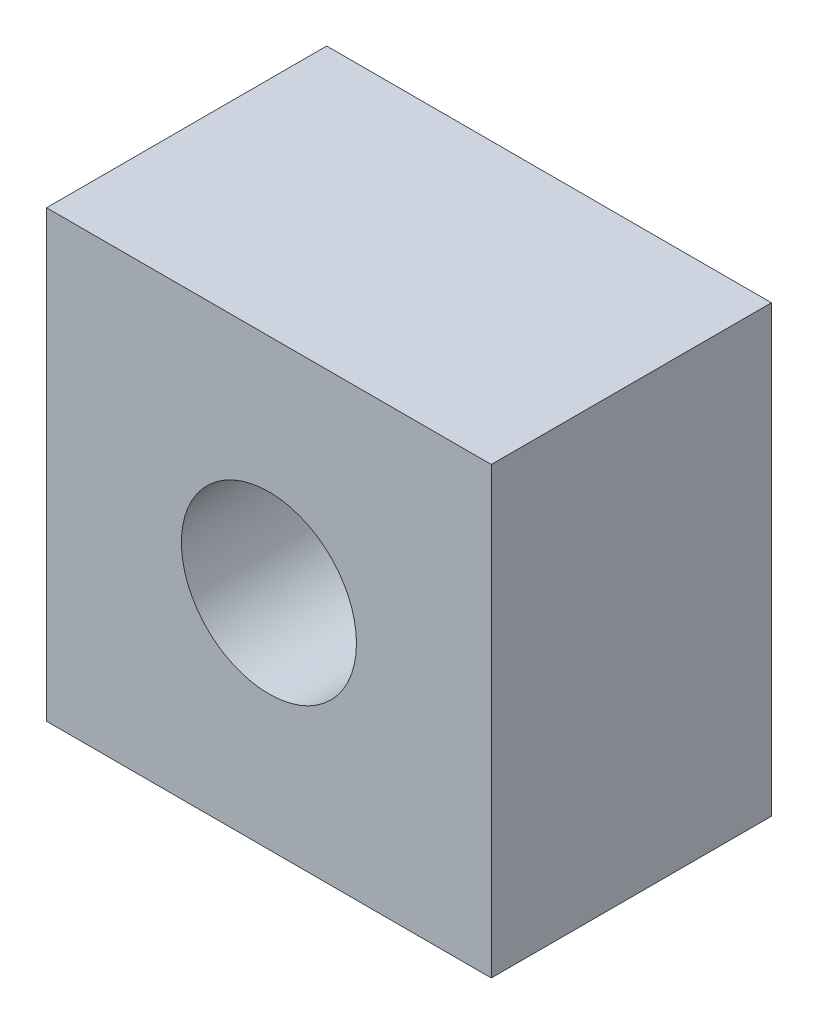
ISO-10303-21;
HEADER;
FILE_DESCRIPTION(('STEP AP214'),'2;1');
FILE_NAME('part.step','',(''),(''),'','','');
FILE_SCHEMA(('AUTOMOTIVE_DESIGN { 1 0 10303 214 1 1 1 1 }'));
ENDSEC;
DATA;
#1=APPLICATION_CONTEXT('core data for automotive mechanical design processes');
#2=APPLICATION_PROTOCOL_DEFINITION('international standard','automotive_design',2000,#1);
#3=PRODUCT_CONTEXT('',#1,'mechanical');
#4=PRODUCT('Part','Part','',(#3));
#5=PRODUCT_RELATED_PRODUCT_CATEGORY('part','',(#4));
#6=PRODUCT_DEFINITION_FORMATION('','',#4);
#7=PRODUCT_DEFINITION_CONTEXT('part definition',#1,'design');
#8=PRODUCT_DEFINITION('design','',#6,#7);
#9=PRODUCT_DEFINITION_SHAPE('','',#8);
#10=(LENGTH_UNIT() NAMED_UNIT(*) SI_UNIT(.MILLI.,.METRE.));
#11=(NAMED_UNIT(*) PLANE_ANGLE_UNIT() SI_UNIT($,.RADIAN.));
#12=(NAMED_UNIT(*) SI_UNIT($,.STERADIAN.) SOLID_ANGLE_UNIT());
#13=UNCERTAINTY_MEASURE_WITH_UNIT(LENGTH_MEASURE(1.E-05),#10,'distance_accuracy_value','');
#14=(GEOMETRIC_REPRESENTATION_CONTEXT(3) GLOBAL_UNCERTAINTY_ASSIGNED_CONTEXT((#13)) GLOBAL_UNIT_ASSIGNED_CONTEXT((#10,
#11,#12)) REPRESENTATION_CONTEXT('',''));
#15=CARTESIAN_POINT('',(0.,0.,0.));
#16=DIRECTION('',(0.,0.,1.));
#17=DIRECTION('',(1.,0.,0.));
#18=AXIS2_PLACEMENT_3D('',#15,#16,#17);
#19=CARTESIAN_POINT('',(1.27,1.27,1.6));
#20=DIRECTION('',(-1.,0.,0.));
#21=DIRECTION('',(0.,-1.,0.));
#22=AXIS2_PLACEMENT_3D('',#19,#20,#21);
#23=PLANE('',#22);
#24=DIRECTION('',(0.,1.,0.));
#25=VECTOR('',#24,1.);
#26=CARTESIAN_POINT('',(1.27,1.27,0.));
#27=LINE('',#26,#25);
#28=CARTESIAN_POINT('',(1.27,-1.27,0.));
#29=VERTEX_POINT('',#28);
#30=CARTESIAN_POINT('',(1.27,1.27,0.));
#31=VERTEX_POINT('',#30);
#32=EDGE_CURVE('E102',#29,#31,#27,.T.);
#33=ORIENTED_EDGE('',*,*,#32,.T.);
#34=DIRECTION('',(0.,0.,-1.));
#35=VECTOR('',#34,1.);
#36=CARTESIAN_POINT('',(1.27,1.27,1.6));
#37=LINE('',#36,#35);
#38=CARTESIAN_POINT('',(1.27,1.27,1.6));
#39=VERTEX_POINT('',#38);
#40=EDGE_CURVE('E11',#39,#31,#37,.T.);
#41=ORIENTED_EDGE('',*,*,#40,.F.);
#42=DIRECTION('',(0.,1.,0.));
#43=VECTOR('',#42,1.);
#44=CARTESIAN_POINT('',(1.27,1.27,1.6));
#45=LINE('',#44,#43);
#46=CARTESIAN_POINT('',(1.27,-1.27,1.6));
#47=VERTEX_POINT('',#46);
#48=EDGE_CURVE('E90',#47,#39,#45,.T.);
#49=ORIENTED_EDGE('',*,*,#48,.F.);
#50=DIRECTION('',(0.,0.,-1.));
#51=VECTOR('',#50,1.);
#52=CARTESIAN_POINT('',(1.27,-1.27,1.6));
#53=LINE('',#52,#51);
#54=EDGE_CURVE('E98',#47,#29,#53,.T.);
#55=ORIENTED_EDGE('',*,*,#54,.T.);
#56=EDGE_LOOP('',(#33,#41,#49,#55));
#57=FACE_BOUND('',#56,.T.);
#58=ADVANCED_FACE('F39',(#57),#23,.F.);
#59=CARTESIAN_POINT('',(-1.27,1.27,1.6));
#60=DIRECTION('',(0.,-1.,0.));
#61=DIRECTION('',(0.,0.,-1.));
#62=AXIS2_PLACEMENT_3D('',#59,#60,#61);
#63=PLANE('',#62);
#64=DIRECTION('',(-1.,0.,0.));
#65=VECTOR('',#64,1.);
#66=CARTESIAN_POINT('',(-1.27,1.27,0.));
#67=LINE('',#66,#65);
#68=CARTESIAN_POINT('',(-1.27,1.27,0.));
#69=VERTEX_POINT('',#68);
#70=EDGE_CURVE('E94',#31,#69,#67,.T.);
#71=ORIENTED_EDGE('',*,*,#70,.T.);
#72=DIRECTION('',(0.,0.,-1.));
#73=VECTOR('',#72,1.);
#74=CARTESIAN_POINT('',(-1.27,1.27,1.6));
#75=LINE('',#74,#73);
#76=CARTESIAN_POINT('',(-1.27,1.27,1.6));
#77=VERTEX_POINT('',#76);
#78=EDGE_CURVE('E47',#77,#69,#75,.T.);
#79=ORIENTED_EDGE('',*,*,#78,.F.);
#80=DIRECTION('',(-1.,0.,0.));
#81=VECTOR('',#80,1.);
#82=CARTESIAN_POINT('',(-1.27,1.27,1.6));
#83=LINE('',#82,#81);
#84=EDGE_CURVE('E85',#39,#77,#83,.T.);
#85=ORIENTED_EDGE('',*,*,#84,.F.);
#86=ORIENTED_EDGE('',*,*,#40,.T.);
#87=EDGE_LOOP('',(#71,#79,#85,#86));
#88=FACE_BOUND('',#87,.T.);
#89=ADVANCED_FACE('F93',(#88),#63,.F.);
#90=CARTESIAN_POINT('',(-1.27,1.27,1.6));
#91=DIRECTION('',(1.,0.,0.));
#92=DIRECTION('',(0.,1.,0.));
#93=AXIS2_PLACEMENT_3D('',#90,#91,#92);
#94=PLANE('',#93);
#95=DIRECTION('',(0.,-1.,0.));
#96=VECTOR('',#95,1.);
#97=CARTESIAN_POINT('',(-1.27,1.27,0.));
#98=LINE('',#97,#96);
#99=CARTESIAN_POINT('',(-1.27,-1.27,0.));
#100=VERTEX_POINT('',#99);
#101=EDGE_CURVE('E72',#69,#100,#98,.T.);
#102=ORIENTED_EDGE('',*,*,#101,.T.);
#103=DIRECTION('',(0.,0.,-1.));
#104=VECTOR('',#103,1.);
#105=CARTESIAN_POINT('',(-1.27,-1.27,1.6));
#106=LINE('',#105,#104);
#107=CARTESIAN_POINT('',(-1.27,-1.27,1.6));
#108=VERTEX_POINT('',#107);
#109=EDGE_CURVE('E95',#108,#100,#106,.T.);
#110=ORIENTED_EDGE('',*,*,#109,.F.);
#111=DIRECTION('',(0.,-1.,0.));
#112=VECTOR('',#111,1.);
#113=CARTESIAN_POINT('',(-1.27,1.27,1.6));
#114=LINE('',#113,#112);
#115=EDGE_CURVE('E88',#77,#108,#114,.T.);
#116=ORIENTED_EDGE('',*,*,#115,.F.);
#117=ORIENTED_EDGE('',*,*,#78,.T.);
#118=EDGE_LOOP('',(#102,#110,#116,#117));
#119=FACE_BOUND('',#118,.T.);
#120=ADVANCED_FACE('F96',(#119),#94,.F.);
#121=CARTESIAN_POINT('',(-1.27,-1.27,1.6));
#122=DIRECTION('',(0.,1.,0.));
#123=DIRECTION('',(0.,0.,1.));
#124=AXIS2_PLACEMENT_3D('',#121,#122,#123);
#125=PLANE('',#124);
#126=DIRECTION('',(1.,0.,0.));
#127=VECTOR('',#126,1.);
#128=CARTESIAN_POINT('',(-1.27,-1.27,0.));
#129=LINE('',#128,#127);
#130=EDGE_CURVE('E78',#100,#29,#129,.T.);
#131=ORIENTED_EDGE('',*,*,#130,.T.);
#132=ORIENTED_EDGE('',*,*,#54,.F.);
#133=DIRECTION('',(1.,0.,0.));
#134=VECTOR('',#133,1.);
#135=CARTESIAN_POINT('',(-1.27,-1.27,1.6));
#136=LINE('',#135,#134);
#137=EDGE_CURVE('E55',#108,#47,#136,.T.);
#138=ORIENTED_EDGE('',*,*,#137,.F.);
#139=ORIENTED_EDGE('',*,*,#109,.T.);
#140=EDGE_LOOP('',(#131,#132,#138,#139));
#141=FACE_BOUND('',#140,.T.);
#142=ADVANCED_FACE('F110',(#141),#125,.F.);
#143=CARTESIAN_POINT('',(0.,0.,1.6));
#144=DIRECTION('',(0.,0.,1.));
#145=DIRECTION('',(1.,0.,0.));
#146=AXIS2_PLACEMENT_3D('',#143,#144,#145);
#147=PLANE('',#146);
#148=CARTESIAN_POINT('',(0.,0.,1.6));
#149=DIRECTION('',(0.,0.,1.));
#150=DIRECTION('',(1.,0.,0.));
#151=AXIS2_PLACEMENT_3D('',#148,#149,#150);
#152=CIRCLE('',#151,0.5);
#153=CARTESIAN_POINT('',(0.5,0.,1.6));
#154=VERTEX_POINT('',#153);
#155=EDGE_CURVE('E116',#154,#154,#152,.T.);
#156=ORIENTED_EDGE('',*,*,#155,.F.);
#157=EDGE_LOOP('',(#156));
#158=FACE_BOUND('',#157,.T.);
#159=ORIENTED_EDGE('',*,*,#48,.T.);
#160=ORIENTED_EDGE('',*,*,#84,.T.);
#161=ORIENTED_EDGE('',*,*,#115,.T.);
#162=ORIENTED_EDGE('',*,*,#137,.T.);
#163=EDGE_LOOP('',(#159,#160,#161,#162));
#164=FACE_BOUND('',#163,.T.);
#165=ADVANCED_FACE('F86',(#158,#164),#147,.T.);
#166=CARTESIAN_POINT('',(0.,0.,0.));
#167=DIRECTION('',(0.,0.,1.));
#168=DIRECTION('',(1.,0.,0.));
#169=AXIS2_PLACEMENT_3D('',#166,#167,#168);
#170=PLANE('',#169);
#171=CARTESIAN_POINT('',(0.,0.,0.));
#172=DIRECTION('',(0.,0.,1.));
#173=DIRECTION('',(1.,0.,0.));
#174=AXIS2_PLACEMENT_3D('',#171,#172,#173);
#175=CIRCLE('',#174,0.5);
#176=CARTESIAN_POINT('',(0.5,0.,0.));
#177=VERTEX_POINT('',#176);
#178=EDGE_CURVE('E105',#177,#177,#175,.T.);
#179=ORIENTED_EDGE('',*,*,#178,.T.);
#180=EDGE_LOOP('',(#179));
#181=FACE_BOUND('',#180,.T.);
#182=ORIENTED_EDGE('',*,*,#32,.F.);
#183=ORIENTED_EDGE('',*,*,#130,.F.);
#184=ORIENTED_EDGE('',*,*,#101,.F.);
#185=ORIENTED_EDGE('',*,*,#70,.F.);
#186=EDGE_LOOP('',(#182,#183,#184,#185));
#187=FACE_BOUND('',#186,.T.);
#188=ADVANCED_FACE('F113',(#181,#187),#170,.F.);
#189=CARTESIAN_POINT('',(0.,0.,0.));
#190=DIRECTION('',(0.,0.,1.));
#191=DIRECTION('',(1.,0.,0.));
#192=AXIS2_PLACEMENT_3D('',#189,#190,#191);
#193=CYLINDRICAL_SURFACE('',#192,0.5);
#194=ORIENTED_EDGE('',*,*,#178,.F.);
#195=EDGE_LOOP('',(#194));
#196=FACE_BOUND('',#195,.T.);
#197=ORIENTED_EDGE('',*,*,#155,.T.);
#198=EDGE_LOOP('',(#197));
#199=FACE_BOUND('',#198,.T.);
#200=ADVANCED_FACE('F123',(#196,#199),#193,.F.);
#201=CLOSED_SHELL('',(#58,#89,#120,#142,#165,#188,#200));
#202=MANIFOLD_SOLID_BREP('B2',#201);
#203=ADVANCED_BREP_SHAPE_REPRESENTATION('',(#18,#202),#14);
#204=SHAPE_DEFINITION_REPRESENTATION(#9,#203);
ENDSEC;
END-ISO-10303-21;
